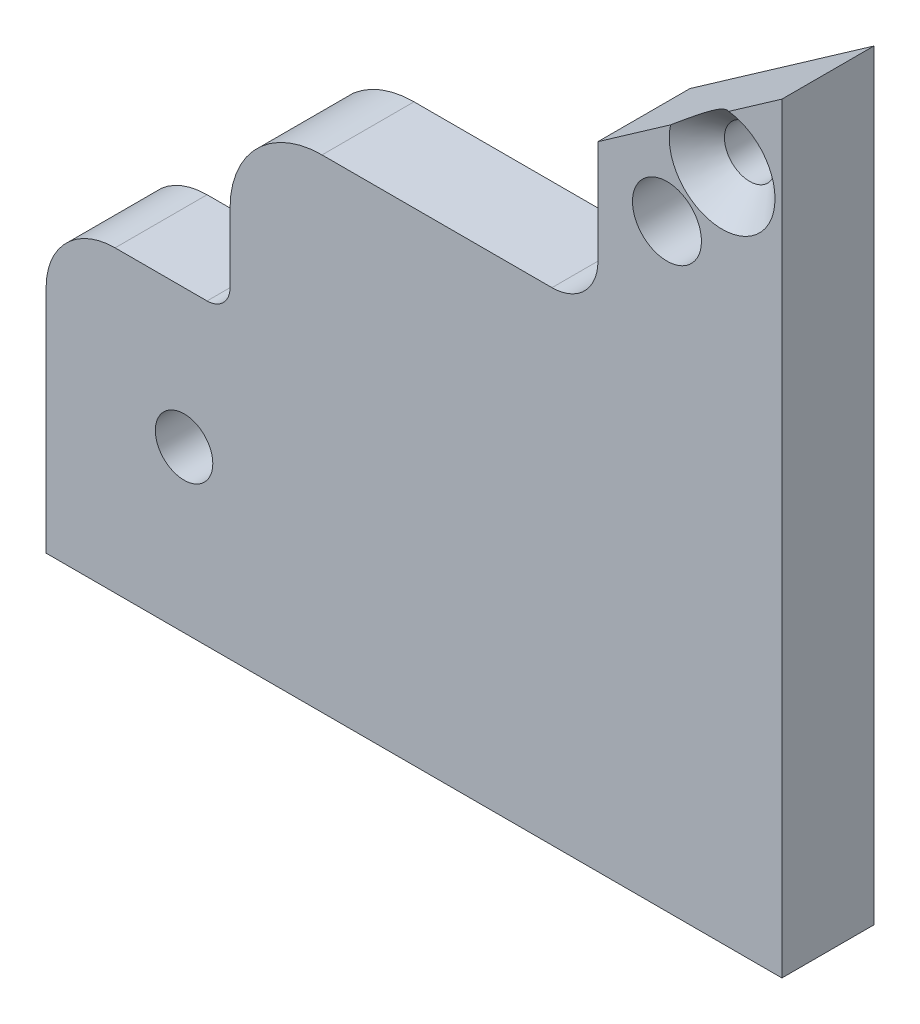
ISO-10303-21;
HEADER;
FILE_DESCRIPTION(('STEP AP214'),'2;1');
FILE_NAME('part.step','',(''),(''),'','','');
FILE_SCHEMA(('AUTOMOTIVE_DESIGN { 1 0 10303 214 1 1 1 1 }'));
ENDSEC;
DATA;
#1=APPLICATION_CONTEXT('core data for automotive mechanical design processes');
#2=APPLICATION_PROTOCOL_DEFINITION('international standard','automotive_design',2000,#1);
#3=PRODUCT_CONTEXT('',#1,'mechanical');
#4=PRODUCT('Part','Part','',(#3));
#5=PRODUCT_RELATED_PRODUCT_CATEGORY('part','',(#4));
#6=PRODUCT_DEFINITION_FORMATION('','',#4);
#7=PRODUCT_DEFINITION_CONTEXT('part definition',#1,'design');
#8=PRODUCT_DEFINITION('design','',#6,#7);
#9=PRODUCT_DEFINITION_SHAPE('','',#8);
#10=(LENGTH_UNIT() NAMED_UNIT(*) SI_UNIT(.MILLI.,.METRE.));
#11=(NAMED_UNIT(*) PLANE_ANGLE_UNIT() SI_UNIT($,.RADIAN.));
#12=(NAMED_UNIT(*) SI_UNIT($,.STERADIAN.) SOLID_ANGLE_UNIT());
#13=UNCERTAINTY_MEASURE_WITH_UNIT(LENGTH_MEASURE(1.E-05),#10,'distance_accuracy_value','');
#14=(GEOMETRIC_REPRESENTATION_CONTEXT(3) GLOBAL_UNCERTAINTY_ASSIGNED_CONTEXT((#13)) GLOBAL_UNIT_ASSIGNED_CONTEXT((#10,
#11,#12)) REPRESENTATION_CONTEXT('',''));
#15=CARTESIAN_POINT('',(0.,0.,0.));
#16=DIRECTION('',(0.,0.,1.));
#17=DIRECTION('',(1.,0.,0.));
#18=AXIS2_PLACEMENT_3D('',#15,#16,#17);
#19=CARTESIAN_POINT('',(0.,0.,4.));
#20=DIRECTION('',(0.,0.,-1.));
#21=DIRECTION('',(-1.,0.,0.));
#22=AXIS2_PLACEMENT_3D('',#19,#20,#21);
#23=PLANE('',#22);
#24=CARTESIAN_POINT('',(6.,5.000000306,4.));
#25=DIRECTION('',(0.,0.,1.));
#26=DIRECTION('',(1.,0.,0.));
#27=AXIS2_PLACEMENT_3D('',#24,#25,#26);
#28=CIRCLE('',#27,1.25);
#29=CARTESIAN_POINT('',(7.25,5.000000306,4.));
#30=VERTEX_POINT('',#29);
#31=EDGE_CURVE('E539',#30,#30,#28,.T.);
#32=ORIENTED_EDGE('',*,*,#31,.F.);
#33=EDGE_LOOP('',(#32));
#34=FACE_BOUND('',#33,.T.);
#35=CARTESIAN_POINT('',(27.,24.,4.));
#36=DIRECTION('',(0.,0.,1.));
#37=DIRECTION('',(1.,0.,0.));
#38=AXIS2_PLACEMENT_3D('',#35,#36,#37);
#39=CIRCLE('',#38,1.5);
#40=CARTESIAN_POINT('',(28.5,24.,4.));
#41=VERTEX_POINT('',#40);
#42=EDGE_CURVE('E169',#41,#41,#39,.T.);
#43=ORIENTED_EDGE('',*,*,#42,.F.);
#44=EDGE_LOOP('',(#43));
#45=FACE_BOUND('',#44,.T.);
#46=DIRECTION('',(1.,0.,0.));
#47=VECTOR('',#46,1.);
#48=CARTESIAN_POINT('',(8.,19.000000306,4.));
#49=LINE('',#48,#47);
#50=CARTESIAN_POINT('',(12.,19.000000306,4.));
#51=VERTEX_POINT('',#50);
#52=CARTESIAN_POINT('',(22.,19.000000306,4.));
#53=VERTEX_POINT('',#52);
#54=EDGE_CURVE('E175',#51,#53,#49,.T.);
#55=ORIENTED_EDGE('',*,*,#54,.F.);
#56=CARTESIAN_POINT('',(12.,15.000000306,4.));
#57=DIRECTION('',(0.,0.,-1.));
#58=DIRECTION('',(-1.,0.,0.));
#59=AXIS2_PLACEMENT_3D('',#56,#57,#58);
#60=CIRCLE('',#59,4.);
#61=CARTESIAN_POINT('',(8.,15.000000306,4.));
#62=VERTEX_POINT('',#61);
#63=EDGE_CURVE('E54',#51,#62,#60,.F.);
#64=ORIENTED_EDGE('',*,*,#63,.T.);
#65=DIRECTION('',(0.,1.,0.));
#66=VECTOR('',#65,1.);
#67=CARTESIAN_POINT('',(8.,11.000000306,4.));
#68=LINE('',#67,#66);
#69=CARTESIAN_POINT('',(8.,12.000000306,4.));
#70=VERTEX_POINT('',#69);
#71=EDGE_CURVE('E187',#70,#62,#68,.T.);
#72=ORIENTED_EDGE('',*,*,#71,.F.);
#73=CARTESIAN_POINT('',(7.,12.000000306,4.));
#74=DIRECTION('',(0.,0.,-1.));
#75=DIRECTION('',(-1.,0.,0.));
#76=AXIS2_PLACEMENT_3D('',#73,#74,#75);
#77=CIRCLE('',#76,1.);
#78=CARTESIAN_POINT('',(7.,11.000000306,4.));
#79=VERTEX_POINT('',#78);
#80=EDGE_CURVE('E351',#70,#79,#77,.T.);
#81=ORIENTED_EDGE('',*,*,#80,.T.);
#82=DIRECTION('',(1.,0.,0.));
#83=VECTOR('',#82,1.);
#84=CARTESIAN_POINT('',(0.,11.000000306,4.));
#85=LINE('',#84,#83);
#86=CARTESIAN_POINT('',(3.,11.000000306,4.));
#87=VERTEX_POINT('',#86);
#88=EDGE_CURVE('E190',#87,#79,#85,.T.);
#89=ORIENTED_EDGE('',*,*,#88,.F.);
#90=CARTESIAN_POINT('',(3.,8.00000030600001,4.));
#91=DIRECTION('',(0.,0.,-1.));
#92=DIRECTION('',(-1.,0.,0.));
#93=AXIS2_PLACEMENT_3D('',#90,#91,#92);
#94=CIRCLE('',#93,3.);
#95=CARTESIAN_POINT('',(0.,8.00000030600001,4.));
#96=VERTEX_POINT('',#95);
#97=EDGE_CURVE('E306',#87,#96,#94,.F.);
#98=ORIENTED_EDGE('',*,*,#97,.T.);
#99=DIRECTION('',(0.,1.,0.));
#100=VECTOR('',#99,1.);
#101=CARTESIAN_POINT('',(0.,-1.999999694,4.));
#102=LINE('',#101,#100);
#103=CARTESIAN_POINT('',(0.,-1.999999694,4.));
#104=VERTEX_POINT('',#103);
#105=EDGE_CURVE('E196',#104,#96,#102,.T.);
#106=ORIENTED_EDGE('',*,*,#105,.F.);
#107=DIRECTION('',(-1.,0.,0.));
#108=VECTOR('',#107,1.);
#109=CARTESIAN_POINT('',(32.,-1.999999694,4.));
#110=LINE('',#109,#108);
#111=CARTESIAN_POINT('',(32.,-1.999999694,4.));
#112=VERTEX_POINT('',#111);
#113=EDGE_CURVE('E193',#112,#104,#110,.T.);
#114=ORIENTED_EDGE('',*,*,#113,.F.);
#115=DIRECTION('',(0.,-1.,0.));
#116=VECTOR('',#115,1.);
#117=CARTESIAN_POINT('',(32.,31.101660306,4.));
#118=LINE('',#117,#116);
#119=CARTESIAN_POINT('',(32.,31.101660306,4.));
#120=VERTEX_POINT('',#119);
#121=EDGE_CURVE('E201',#120,#112,#118,.T.);
#122=ORIENTED_EDGE('',*,*,#121,.F.);
#123=DIRECTION('',(0.819152044273487,0.573576436373189,0.));
#124=VECTOR('',#123,1.);
#125=CARTESIAN_POINT('',(-4.0853226345545,5.83444537710179,4.));
#126=LINE('',#125,#124);
#127=CARTESIAN_POINT('',(29.686931200116,29.4820320958304,4.));
#128=VERTEX_POINT('',#127);
#129=EDGE_CURVE('E200',#128,#120,#126,.T.);
#130=ORIENTED_EDGE('',*,*,#129,.F.);
#131=CARTESIAN_POINT('',(29.4,27.2,4.));
#132=DIRECTION('',(0.,0.,1.));
#133=DIRECTION('',(1.,0.,0.));
#134=AXIS2_PLACEMENT_3D('',#131,#132,#133);
#135=CIRCLE('',#134,2.3);
#136=CARTESIAN_POINT('',(27.1574550289357,27.7108738129462,4.));
#137=VERTEX_POINT('',#136);
#138=EDGE_CURVE('E163',#137,#128,#135,.T.);
#139=ORIENTED_EDGE('',*,*,#138,.F.);
#140=CARTESIAN_POINT('',(24.,25.5,4.));
#141=VERTEX_POINT('',#140);
#142=EDGE_CURVE('E205',#141,#137,#126,.T.);
#143=ORIENTED_EDGE('',*,*,#142,.F.);
#144=DIRECTION('',(0.,1.,0.));
#145=VECTOR('',#144,1.);
#146=CARTESIAN_POINT('',(24.,19.000000306,4.));
#147=LINE('',#146,#145);
#148=CARTESIAN_POINT('',(24.,21.000000306,4.));
#149=VERTEX_POINT('',#148);
#150=EDGE_CURVE('E179',#149,#141,#147,.T.);
#151=ORIENTED_EDGE('',*,*,#150,.F.);
#152=CARTESIAN_POINT('',(22.,21.000000306,4.));
#153=DIRECTION('',(0.,0.,-1.));
#154=DIRECTION('',(-1.,0.,0.));
#155=AXIS2_PLACEMENT_3D('',#152,#153,#154);
#156=CIRCLE('',#155,2.);
#157=EDGE_CURVE('E331',#149,#53,#156,.T.);
#158=ORIENTED_EDGE('',*,*,#157,.T.);
#159=EDGE_LOOP('',(#55,#64,#72,#81,#89,#98,#106,#114,#122,#130,#139,#143,#151,#158));
#160=FACE_BOUND('',#159,.T.);
#161=ADVANCED_FACE('F32',(#34,#45,#160),#23,.F.);
#162=CARTESIAN_POINT('',(32.,-1.999999694,4.));
#163=DIRECTION('',(0.,-1.,0.));
#164=DIRECTION('',(0.,0.,-1.));
#165=AXIS2_PLACEMENT_3D('',#162,#163,#164);
#166=PLANE('',#165);
#167=CARTESIAN_POINT('',(10.,-1.999999694,2.));
#168=DIRECTION('',(0.,-1.,0.));
#169=DIRECTION('',(0.,0.,-1.));
#170=AXIS2_PLACEMENT_3D('',#167,#168,#169);
#171=CIRCLE('',#170,1.24999999999999);
#172=CARTESIAN_POINT('',(10.,-1.999999694,0.750000000000011));
#173=VERTEX_POINT('',#172);
#174=EDGE_CURVE('E145',#173,#173,#171,.T.);
#175=ORIENTED_EDGE('',*,*,#174,.F.);
#176=EDGE_LOOP('',(#175));
#177=FACE_BOUND('',#176,.T.);
#178=CARTESIAN_POINT('',(19.5,-1.999999694,2.));
#179=DIRECTION('',(0.,-1.,0.));
#180=DIRECTION('',(0.,0.,-1.));
#181=AXIS2_PLACEMENT_3D('',#178,#179,#180);
#182=CIRCLE('',#181,1.24999999999999);
#183=CARTESIAN_POINT('',(19.5,-1.999999694,0.750000000000013));
#184=VERTEX_POINT('',#183);
#185=EDGE_CURVE('E144',#184,#184,#182,.T.);
#186=ORIENTED_EDGE('',*,*,#185,.F.);
#187=EDGE_LOOP('',(#186));
#188=FACE_BOUND('',#187,.T.);
#189=CARTESIAN_POINT('',(29.,-1.999999694,2.));
#190=DIRECTION('',(0.,-1.,0.));
#191=DIRECTION('',(0.,0.,-1.));
#192=AXIS2_PLACEMENT_3D('',#189,#190,#191);
#193=CIRCLE('',#192,1.24999999999999);
#194=CARTESIAN_POINT('',(29.,-1.999999694,0.750000000000013));
#195=VERTEX_POINT('',#194);
#196=EDGE_CURVE('E157',#195,#195,#193,.T.);
#197=ORIENTED_EDGE('',*,*,#196,.F.);
#198=EDGE_LOOP('',(#197));
#199=FACE_BOUND('',#198,.T.);
#200=DIRECTION('',(-1.,0.,0.));
#201=VECTOR('',#200,1.);
#202=CARTESIAN_POINT('',(32.,-1.999999694,0.));
#203=LINE('',#202,#201);
#204=CARTESIAN_POINT('',(32.,-1.999999694,0.));
#205=VERTEX_POINT('',#204);
#206=CARTESIAN_POINT('',(0.,-1.999999694,0.));
#207=VERTEX_POINT('',#206);
#208=EDGE_CURVE('E189',#205,#207,#203,.T.);
#209=ORIENTED_EDGE('',*,*,#208,.F.);
#210=DIRECTION('',(0.,0.,-1.));
#211=VECTOR('',#210,1.);
#212=CARTESIAN_POINT('',(32.,-1.999999694,4.));
#213=LINE('',#212,#211);
#214=EDGE_CURVE('E214',#112,#205,#213,.T.);
#215=ORIENTED_EDGE('',*,*,#214,.F.);
#216=ORIENTED_EDGE('',*,*,#113,.T.);
#217=DIRECTION('',(0.,0.,-1.));
#218=VECTOR('',#217,1.);
#219=CARTESIAN_POINT('',(0.,-1.999999694,4.));
#220=LINE('',#219,#218);
#221=EDGE_CURVE('E204',#104,#207,#220,.T.);
#222=ORIENTED_EDGE('',*,*,#221,.T.);
#223=EDGE_LOOP('',(#209,#215,#216,#222));
#224=FACE_BOUND('',#223,.T.);
#225=ADVANCED_FACE('F272',(#177,#188,#199,#224),#166,.T.);
#226=CARTESIAN_POINT('',(32.,31.101660306,4.));
#227=DIRECTION('',(1.,0.,0.));
#228=DIRECTION('',(0.,1.,0.));
#229=AXIS2_PLACEMENT_3D('',#226,#227,#228);
#230=PLANE('',#229);
#231=DIRECTION('',(0.,-1.,0.));
#232=VECTOR('',#231,1.);
#233=CARTESIAN_POINT('',(32.,31.101660306,0.));
#234=LINE('',#233,#232);
#235=CARTESIAN_POINT('',(32.,31.101660306,0.));
#236=VERTEX_POINT('',#235);
#237=EDGE_CURVE('E197',#236,#205,#234,.T.);
#238=ORIENTED_EDGE('',*,*,#237,.F.);
#239=DIRECTION('',(0.,0.,-1.));
#240=VECTOR('',#239,1.);
#241=CARTESIAN_POINT('',(32.,31.101660306,4.));
#242=LINE('',#241,#240);
#243=EDGE_CURVE('E217',#120,#236,#242,.T.);
#244=ORIENTED_EDGE('',*,*,#243,.F.);
#245=ORIENTED_EDGE('',*,*,#121,.T.);
#246=ORIENTED_EDGE('',*,*,#214,.T.);
#247=EDGE_LOOP('',(#238,#244,#245,#246));
#248=FACE_BOUND('',#247,.T.);
#249=ADVANCED_FACE('F278',(#248),#230,.T.);
#250=CARTESIAN_POINT('',(32.,31.101660306,4.));
#251=DIRECTION('',(-0.573576436373189,0.819152044273487,0.));
#252=DIRECTION('',(-0.819152044273487,-0.573576436373189,0.));
#253=AXIS2_PLACEMENT_3D('',#250,#251,#252);
#254=PLANE('',#253);
#255=CARTESIAN_POINT('',(29.6871752413753,29.4822029753598,4.0002));
#256=CARTESIAN_POINT('',(29.6563174845452,29.4605961414138,3.97491308650536));
#257=CARTESIAN_POINT('',(29.6252700095637,29.4388564653882,3.94997173756694));
#258=CARTESIAN_POINT('',(29.5627369877199,29.3950703721036,3.90089970834249));
#259=CARTESIAN_POINT('',(29.5312513271724,29.3730238752415,3.87676924419805));
#260=CARTESIAN_POINT('',(29.4357242058154,29.30613506476,3.80553281197614));
#261=CARTESIAN_POINT('',(29.3709514727864,29.26078070882,3.75986326771957));
#262=CARTESIAN_POINT('',(29.2370140747331,29.1669967330495,3.67248883989887));
#263=CARTESIAN_POINT('',(29.1677755101563,29.1185153681952,3.63095068172284));
#264=CARTESIAN_POINT('',(29.0265235255745,29.0196096637982,3.55592828304742));
#265=CARTESIAN_POINT('',(28.9545170335315,28.9691901752668,3.52242528268573));
#266=CARTESIAN_POINT('',(28.839332131466,28.888536838548,3.47852790803711));
#267=CARTESIAN_POINT('',(28.7971092689902,28.8589720719559,3.46439804019855));
#268=CARTESIAN_POINT('',(28.7118568240857,28.7992776673795,3.44030735575251));
#269=CARTESIAN_POINT('',(28.6688272109409,28.7691480078876,3.43034669822101));
#270=CARTESIAN_POINT('',(28.5827482560978,28.7088748748218,3.41520738247593));
#271=CARTESIAN_POINT('',(28.5397058807132,28.6787362791133,3.40997052081304));
#272=CARTESIAN_POINT('',(28.453408580565,28.6183102590189,3.40436894590551));
#273=CARTESIAN_POINT('',(28.4101536724635,28.5880228462999,3.40400385663571));
#274=CARTESIAN_POINT('',(28.323770098958,28.5275364169503,3.40817039058304));
#275=CARTESIAN_POINT('',(28.2806415582932,28.4973374876631,3.41270583228457));
#276=CARTESIAN_POINT('',(28.1948895301399,28.43729327113,3.42640870532257));
#277=CARTESIAN_POINT('',(28.1522661034704,28.40744802647,3.43557668876262));
#278=CARTESIAN_POINT('',(28.0245129596602,28.3179943121389,3.46961039771885));
#279=CARTESIAN_POINT('',(27.9405224590675,28.2591835304825,3.50093922253187));
#280=CARTESIAN_POINT('',(27.7952433970048,28.1574580360763,3.56729608258622));
#281=CARTESIAN_POINT('',(27.7331464262419,28.1139772690457,3.59985040505804));
#282=CARTESIAN_POINT('',(27.6109886602601,28.0284414804494,3.67042418593524));
#283=CARTESIAN_POINT('',(27.5509304609802,27.9863882765799,3.70845031104726));
#284=CARTESIAN_POINT('',(27.4343948231385,27.9047891444884,3.78732204805841));
#285=CARTESIAN_POINT('',(27.3778640257031,27.8652058539808,3.82805223830328));
#286=CARTESIAN_POINT('',(27.2664346427706,27.787182160069,3.91226213513065));
#287=CARTESIAN_POINT('',(27.2115314597235,27.7487385374254,3.95573273649033));
#288=CARTESIAN_POINT('',(27.1572109876764,27.7107029334168,4.0002));
#289=B_SPLINE_CURVE_WITH_KNOTS('',3,(#255,#256,#257,#258,#259,#260,#261,#262,#263,#264,#265,
#266,#267,#268,#269,#270,#271,#272,#273,#274,#275,#276,#277,#278,#279,#280,#281,#282,#283,#284,
#285,#286,#287,#288),.UNSPECIFIED.,.F.,.F.,(4,2,2,2,2,2,2,2,2,2,2,2,2,2,2,2,4),(0.,
0.136107448133705,0.272250892530432,0.546037490513639,0.828308752564645,1.1099144303528,
1.27011034893967,1.43031237923538,1.58851242096433,1.74670025203663,1.90501143171284,
2.06334148327353,2.38370159800648,2.63098941649179,2.87858111616212,3.11891025636134,
3.35847915440165),.UNSPECIFIED.);
#290=EDGE_CURVE('E216',#128,#137,#289,.T.);
#291=ORIENTED_EDGE('',*,*,#290,.F.);
#292=ORIENTED_EDGE('',*,*,#129,.T.);
#293=ORIENTED_EDGE('',*,*,#243,.T.);
#294=DIRECTION('',(0.819152044273487,0.573576436373189,0.));
#295=VECTOR('',#294,1.);
#296=CARTESIAN_POINT('',(-4.0853226345545,5.83444537710179,0.));
#297=LINE('',#296,#295);
#298=CARTESIAN_POINT('',(24.,25.5,0.));
#299=VERTEX_POINT('',#298);
#300=EDGE_CURVE('E211',#299,#236,#297,.T.);
#301=ORIENTED_EDGE('',*,*,#300,.F.);
#302=DIRECTION('',(0.,0.,1.));
#303=VECTOR('',#302,1.);
#304=CARTESIAN_POINT('',(24.,25.5,0.));
#305=LINE('',#304,#303);
#306=EDGE_CURVE('E181',#299,#141,#305,.T.);
#307=ORIENTED_EDGE('',*,*,#306,.T.);
#308=ORIENTED_EDGE('',*,*,#142,.T.);
#309=EDGE_LOOP('',(#291,#292,#293,#301,#307,#308));
#310=FACE_BOUND('',#309,.T.);
#311=ADVANCED_FACE('F234',(#310),#254,.T.);
#312=CARTESIAN_POINT('',(0.,-1.999999694,4.));
#313=DIRECTION('',(-1.,0.,0.));
#314=DIRECTION('',(0.,0.,1.));
#315=AXIS2_PLACEMENT_3D('',#312,#313,#314);
#316=PLANE('',#315);
#317=ORIENTED_EDGE('',*,*,#105,.T.);
#318=DIRECTION('',(0.,0.,1.));
#319=VECTOR('',#318,1.);
#320=CARTESIAN_POINT('',(0.,8.00000030600001,0.));
#321=LINE('',#320,#319);
#322=CARTESIAN_POINT('',(0.,8.00000030600001,0.));
#323=VERTEX_POINT('',#322);
#324=EDGE_CURVE('E308',#96,#323,#321,.F.);
#325=ORIENTED_EDGE('',*,*,#324,.T.);
#326=DIRECTION('',(0.,1.,0.));
#327=VECTOR('',#326,1.);
#328=CARTESIAN_POINT('',(0.,-1.999999694,0.));
#329=LINE('',#328,#327);
#330=EDGE_CURVE('E208',#207,#323,#329,.T.);
#331=ORIENTED_EDGE('',*,*,#330,.F.);
#332=ORIENTED_EDGE('',*,*,#221,.F.);
#333=EDGE_LOOP('',(#317,#325,#331,#332));
#334=FACE_BOUND('',#333,.T.);
#335=ADVANCED_FACE('F276',(#334),#316,.T.);
#336=CARTESIAN_POINT('',(0.,0.,0.));
#337=DIRECTION('',(0.,0.,-1.));
#338=DIRECTION('',(-1.,0.,0.));
#339=AXIS2_PLACEMENT_3D('',#336,#337,#338);
#340=PLANE('',#339);
#341=CARTESIAN_POINT('',(6.,5.000000306,0.));
#342=DIRECTION('',(0.,0.,1.));
#343=DIRECTION('',(1.,0.,0.));
#344=AXIS2_PLACEMENT_3D('',#341,#342,#343);
#345=CIRCLE('',#344,1.25);
#346=CARTESIAN_POINT('',(7.25,5.000000306,0.));
#347=VERTEX_POINT('',#346);
#348=EDGE_CURVE('E151',#347,#347,#345,.T.);
#349=ORIENTED_EDGE('',*,*,#348,.T.);
#350=EDGE_LOOP('',(#349));
#351=FACE_BOUND('',#350,.T.);
#352=CARTESIAN_POINT('',(29.4,27.2,0.));
#353=DIRECTION('',(0.,0.,-1.));
#354=DIRECTION('',(-1.,0.,0.));
#355=AXIS2_PLACEMENT_3D('',#352,#353,#354);
#356=CIRCLE('',#355,1.09999999999999);
#357=CARTESIAN_POINT('',(28.3,27.2,0.));
#358=VERTEX_POINT('',#357);
#359=EDGE_CURVE('E168',#358,#358,#356,.T.);
#360=ORIENTED_EDGE('',*,*,#359,.F.);
#361=EDGE_LOOP('',(#360));
#362=FACE_BOUND('',#361,.T.);
#363=CARTESIAN_POINT('',(27.,24.,0.));
#364=DIRECTION('',(0.,0.,1.));
#365=DIRECTION('',(1.,0.,0.));
#366=AXIS2_PLACEMENT_3D('',#363,#364,#365);
#367=CIRCLE('',#366,1.5);
#368=CARTESIAN_POINT('',(28.5,24.,0.));
#369=VERTEX_POINT('',#368);
#370=EDGE_CURVE('E172',#369,#369,#367,.T.);
#371=ORIENTED_EDGE('',*,*,#370,.T.);
#372=EDGE_LOOP('',(#371));
#373=FACE_BOUND('',#372,.T.);
#374=DIRECTION('',(0.,1.,0.));
#375=VECTOR('',#374,1.);
#376=CARTESIAN_POINT('',(8.,11.000000306,0.));
#377=LINE('',#376,#375);
#378=CARTESIAN_POINT('',(8.,12.000000306,0.));
#379=VERTEX_POINT('',#378);
#380=CARTESIAN_POINT('',(8.,15.000000306,0.));
#381=VERTEX_POINT('',#380);
#382=EDGE_CURVE('E186',#379,#381,#377,.T.);
#383=ORIENTED_EDGE('',*,*,#382,.T.);
#384=CARTESIAN_POINT('',(12.,15.000000306,0.));
#385=DIRECTION('',(0.,0.,-1.));
#386=DIRECTION('',(-1.,0.,0.));
#387=AXIS2_PLACEMENT_3D('',#384,#385,#386);
#388=CIRCLE('',#387,4.);
#389=CARTESIAN_POINT('',(12.,19.000000306,0.));
#390=VERTEX_POINT('',#389);
#391=EDGE_CURVE('E11',#381,#390,#388,.T.);
#392=ORIENTED_EDGE('',*,*,#391,.T.);
#393=DIRECTION('',(1.,0.,0.));
#394=VECTOR('',#393,1.);
#395=CARTESIAN_POINT('',(8.,19.000000306,0.));
#396=LINE('',#395,#394);
#397=CARTESIAN_POINT('',(22.,19.000000306,0.));
#398=VERTEX_POINT('',#397);
#399=EDGE_CURVE('E176',#390,#398,#396,.T.);
#400=ORIENTED_EDGE('',*,*,#399,.T.);
#401=CARTESIAN_POINT('',(22.,21.000000306,0.));
#402=DIRECTION('',(0.,0.,-1.));
#403=DIRECTION('',(-1.,0.,0.));
#404=AXIS2_PLACEMENT_3D('',#401,#402,#403);
#405=CIRCLE('',#404,2.);
#406=CARTESIAN_POINT('',(24.,21.000000306,0.));
#407=VERTEX_POINT('',#406);
#408=EDGE_CURVE('E337',#398,#407,#405,.F.);
#409=ORIENTED_EDGE('',*,*,#408,.T.);
#410=DIRECTION('',(0.,1.,0.));
#411=VECTOR('',#410,1.);
#412=CARTESIAN_POINT('',(24.,19.000000306,0.));
#413=LINE('',#412,#411);
#414=EDGE_CURVE('E178',#407,#299,#413,.T.);
#415=ORIENTED_EDGE('',*,*,#414,.T.);
#416=ORIENTED_EDGE('',*,*,#300,.T.);
#417=ORIENTED_EDGE('',*,*,#237,.T.);
#418=ORIENTED_EDGE('',*,*,#208,.T.);
#419=ORIENTED_EDGE('',*,*,#330,.T.);
#420=CARTESIAN_POINT('',(3.,8.00000030600001,0.));
#421=DIRECTION('',(0.,0.,-1.));
#422=DIRECTION('',(-1.,0.,0.));
#423=AXIS2_PLACEMENT_3D('',#420,#421,#422);
#424=CIRCLE('',#423,3.);
#425=CARTESIAN_POINT('',(3.,11.000000306,0.));
#426=VERTEX_POINT('',#425);
#427=EDGE_CURVE('E314',#323,#426,#424,.T.);
#428=ORIENTED_EDGE('',*,*,#427,.T.);
#429=DIRECTION('',(1.,0.,0.));
#430=VECTOR('',#429,1.);
#431=CARTESIAN_POINT('',(0.,11.000000306,0.));
#432=LINE('',#431,#430);
#433=CARTESIAN_POINT('',(7.,11.000000306,0.));
#434=VERTEX_POINT('',#433);
#435=EDGE_CURVE('E184',#426,#434,#432,.T.);
#436=ORIENTED_EDGE('',*,*,#435,.T.);
#437=CARTESIAN_POINT('',(7.,12.000000306,0.));
#438=DIRECTION('',(0.,0.,-1.));
#439=DIRECTION('',(-1.,0.,0.));
#440=AXIS2_PLACEMENT_3D('',#437,#438,#439);
#441=CIRCLE('',#440,1.);
#442=EDGE_CURVE('E344',#434,#379,#441,.F.);
#443=ORIENTED_EDGE('',*,*,#442,.T.);
#444=EDGE_LOOP('',(#383,#392,#400,#409,#415,#416,#417,#418,#419,#428,#436,#443));
#445=FACE_BOUND('',#444,.T.);
#446=ADVANCED_FACE('F266',(#351,#362,#373,#445),#340,.T.);
#447=CARTESIAN_POINT('',(8.,11.000000306,0.));
#448=DIRECTION('',(1.,0.,0.));
#449=DIRECTION('',(0.,0.,-1.));
#450=AXIS2_PLACEMENT_3D('',#447,#448,#449);
#451=PLANE('',#450);
#452=ORIENTED_EDGE('',*,*,#71,.T.);
#453=DIRECTION('',(0.,0.,1.));
#454=VECTOR('',#453,1.);
#455=CARTESIAN_POINT('',(8.,15.000000306,0.));
#456=LINE('',#455,#454);
#457=EDGE_CURVE('E40',#62,#381,#456,.F.);
#458=ORIENTED_EDGE('',*,*,#457,.T.);
#459=ORIENTED_EDGE('',*,*,#382,.F.);
#460=DIRECTION('',(0.,0.,1.));
#461=VECTOR('',#460,1.);
#462=CARTESIAN_POINT('',(8.,12.000000306,4.));
#463=LINE('',#462,#461);
#464=EDGE_CURVE('E232',#379,#70,#463,.T.);
#465=ORIENTED_EDGE('',*,*,#464,.T.);
#466=EDGE_LOOP('',(#452,#458,#459,#465));
#467=FACE_BOUND('',#466,.T.);
#468=ADVANCED_FACE('F263',(#467),#451,.F.);
#469=CARTESIAN_POINT('',(0.,11.000000306,0.));
#470=DIRECTION('',(0.,-1.,0.));
#471=DIRECTION('',(0.,0.,-1.));
#472=AXIS2_PLACEMENT_3D('',#469,#470,#471);
#473=PLANE('',#472);
#474=ORIENTED_EDGE('',*,*,#435,.F.);
#475=DIRECTION('',(0.,0.,1.));
#476=VECTOR('',#475,1.);
#477=CARTESIAN_POINT('',(3.,11.000000306,4.));
#478=LINE('',#477,#476);
#479=EDGE_CURVE('E318',#426,#87,#478,.T.);
#480=ORIENTED_EDGE('',*,*,#479,.T.);
#481=ORIENTED_EDGE('',*,*,#88,.T.);
#482=DIRECTION('',(0.,0.,1.));
#483=VECTOR('',#482,1.);
#484=CARTESIAN_POINT('',(7.,11.000000306,0.));
#485=LINE('',#484,#483);
#486=EDGE_CURVE('E356',#79,#434,#485,.F.);
#487=ORIENTED_EDGE('',*,*,#486,.T.);
#488=EDGE_LOOP('',(#474,#480,#481,#487));
#489=FACE_BOUND('',#488,.T.);
#490=ADVANCED_FACE('F258',(#489),#473,.F.);
#491=CARTESIAN_POINT('',(24.,19.000000306,0.));
#492=DIRECTION('',(1.,0.,0.));
#493=DIRECTION('',(0.,1.,0.));
#494=AXIS2_PLACEMENT_3D('',#491,#492,#493);
#495=PLANE('',#494);
#496=ORIENTED_EDGE('',*,*,#414,.F.);
#497=DIRECTION('',(0.,0.,1.));
#498=VECTOR('',#497,1.);
#499=CARTESIAN_POINT('',(24.,21.000000306,4.));
#500=LINE('',#499,#498);
#501=EDGE_CURVE('E342',#407,#149,#500,.T.);
#502=ORIENTED_EDGE('',*,*,#501,.T.);
#503=ORIENTED_EDGE('',*,*,#150,.T.);
#504=ORIENTED_EDGE('',*,*,#306,.F.);
#505=EDGE_LOOP('',(#496,#502,#503,#504));
#506=FACE_BOUND('',#505,.T.);
#507=ADVANCED_FACE('F255',(#506),#495,.F.);
#508=CARTESIAN_POINT('',(8.,19.000000306,0.));
#509=DIRECTION('',(0.,-1.,0.));
#510=DIRECTION('',(0.,0.,-1.));
#511=AXIS2_PLACEMENT_3D('',#508,#509,#510);
#512=PLANE('',#511);
#513=ORIENTED_EDGE('',*,*,#399,.F.);
#514=DIRECTION('',(0.,0.,1.));
#515=VECTOR('',#514,1.);
#516=CARTESIAN_POINT('',(12.,19.000000306,0.));
#517=LINE('',#516,#515);
#518=EDGE_CURVE('E316',#390,#51,#517,.T.);
#519=ORIENTED_EDGE('',*,*,#518,.T.);
#520=ORIENTED_EDGE('',*,*,#54,.T.);
#521=DIRECTION('',(0.,0.,1.));
#522=VECTOR('',#521,1.);
#523=CARTESIAN_POINT('',(22.,19.000000306,0.));
#524=LINE('',#523,#522);
#525=EDGE_CURVE('E338',#53,#398,#524,.F.);
#526=ORIENTED_EDGE('',*,*,#525,.T.);
#527=EDGE_LOOP('',(#513,#519,#520,#526));
#528=FACE_BOUND('',#527,.T.);
#529=ADVANCED_FACE('F253',(#528),#512,.F.);
#530=CARTESIAN_POINT('',(27.,24.,4.));
#531=DIRECTION('',(0.,0.,1.));
#532=DIRECTION('',(1.,0.,0.));
#533=AXIS2_PLACEMENT_3D('',#530,#531,#532);
#534=CYLINDRICAL_SURFACE('',#533,1.5);
#535=ORIENTED_EDGE('',*,*,#370,.F.);
#536=EDGE_LOOP('',(#535));
#537=FACE_BOUND('',#536,.T.);
#538=ORIENTED_EDGE('',*,*,#42,.T.);
#539=EDGE_LOOP('',(#538));
#540=FACE_BOUND('',#539,.T.);
#541=ADVANCED_FACE('F249',(#537,#540),#534,.F.);
#542=CARTESIAN_POINT('',(29.4,27.2,4.));
#543=DIRECTION('',(0.,0.,1.));
#544=DIRECTION('',(1.,0.,0.));
#545=AXIS2_PLACEMENT_3D('',#542,#543,#544);
#546=CYLINDRICAL_SURFACE('',#545,1.09999999999999);
#547=ORIENTED_EDGE('',*,*,#359,.T.);
#548=EDGE_LOOP('',(#547));
#549=FACE_BOUND('',#548,.T.);
#550=CARTESIAN_POINT('',(29.4,27.2,2.8));
#551=DIRECTION('',(0.,0.,1.));
#552=DIRECTION('',(1.,0.,0.));
#553=AXIS2_PLACEMENT_3D('',#550,#551,#552);
#554=CIRCLE('',#553,1.1);
#555=CARTESIAN_POINT('',(30.5,27.2,2.8));
#556=VERTEX_POINT('',#555);
#557=EDGE_CURVE('E165',#556,#556,#554,.T.);
#558=ORIENTED_EDGE('',*,*,#557,.T.);
#559=EDGE_LOOP('',(#558));
#560=FACE_BOUND('',#559,.T.);
#561=ADVANCED_FACE('F244',(#549,#560),#546,.F.);
#562=CARTESIAN_POINT('',(29.4,27.2,4.));
#563=DIRECTION('',(0.,0.,1.));
#564=DIRECTION('',(1.,0.,0.));
#565=AXIS2_PLACEMENT_3D('',#562,#563,#564);
#566=CONICAL_SURFACE('',#565,2.3,0.785398163397449);
#567=ORIENTED_EDGE('',*,*,#290,.T.);
#568=ORIENTED_EDGE('',*,*,#138,.T.);
#569=EDGE_LOOP('',(#567,#568));
#570=FACE_BOUND('',#569,.T.);
#571=ORIENTED_EDGE('',*,*,#557,.F.);
#572=EDGE_LOOP('',(#571));
#573=FACE_BOUND('',#572,.T.);
#574=ADVANCED_FACE('F238',(#570,#573),#566,.F.);
#575=CARTESIAN_POINT('',(29.,5.50000030599999,2.));
#576=DIRECTION('',(0.,-1.,0.));
#577=DIRECTION('',(0.,0.,-1.));
#578=AXIS2_PLACEMENT_3D('',#575,#576,#577);
#579=CONICAL_SURFACE('',#578,1.24999999999999,1.02974425867664);
#580=CARTESIAN_POINT('',(29.,6.25107607978445,2.));
#581=VERTEX_POINT('',#580);
#582=VERTEX_LOOP('',#581);
#583=FACE_BOUND('',#582,.T.);
#584=CARTESIAN_POINT('',(29.,5.50000030599999,2.));
#585=DIRECTION('',(0.,-1.,0.));
#586=DIRECTION('',(0.,0.,-1.));
#587=AXIS2_PLACEMENT_3D('',#584,#585,#586);
#588=CIRCLE('',#587,1.24999999999999);
#589=CARTESIAN_POINT('',(29.,5.50000030599999,0.750000000000013));
#590=VERTEX_POINT('',#589);
#591=EDGE_CURVE('E160',#590,#590,#588,.T.);
#592=ORIENTED_EDGE('',*,*,#591,.T.);
#593=EDGE_LOOP('',(#592));
#594=FACE_BOUND('',#593,.T.);
#595=ADVANCED_FACE('F243',(#583,#594),#579,.F.);
#596=CARTESIAN_POINT('',(29.,-1.999999694,2.));
#597=DIRECTION('',(0.,-1.,0.));
#598=DIRECTION('',(0.,0.,-1.));
#599=AXIS2_PLACEMENT_3D('',#596,#597,#598);
#600=CYLINDRICAL_SURFACE('',#599,1.24999999999999);
#601=ORIENTED_EDGE('',*,*,#591,.F.);
#602=EDGE_LOOP('',(#601));
#603=FACE_BOUND('',#602,.T.);
#604=ORIENTED_EDGE('',*,*,#196,.T.);
#605=EDGE_LOOP('',(#604));
#606=FACE_BOUND('',#605,.T.);
#607=ADVANCED_FACE('F421',(#603,#606),#600,.F.);
#608=CARTESIAN_POINT('',(19.5,5.50000030599999,2.));
#609=DIRECTION('',(0.,-1.,0.));
#610=DIRECTION('',(0.,0.,-1.));
#611=AXIS2_PLACEMENT_3D('',#608,#609,#610);
#612=CONICAL_SURFACE('',#611,1.24999999999999,1.02974425867664);
#613=CARTESIAN_POINT('',(19.5,6.25107607978445,2.));
#614=VERTEX_POINT('',#613);
#615=VERTEX_LOOP('',#614);
#616=FACE_BOUND('',#615,.T.);
#617=CARTESIAN_POINT('',(19.5,5.50000030599999,2.));
#618=DIRECTION('',(0.,-1.,0.));
#619=DIRECTION('',(0.,0.,-1.));
#620=AXIS2_PLACEMENT_3D('',#617,#618,#619);
#621=CIRCLE('',#620,1.24999999999999);
#622=CARTESIAN_POINT('',(19.5,5.50000030599999,0.750000000000013));
#623=VERTEX_POINT('',#622);
#624=EDGE_CURVE('E148',#623,#623,#621,.T.);
#625=ORIENTED_EDGE('',*,*,#624,.T.);
#626=EDGE_LOOP('',(#625));
#627=FACE_BOUND('',#626,.T.);
#628=ADVANCED_FACE('F428',(#616,#627),#612,.F.);
#629=CARTESIAN_POINT('',(19.5,-1.999999694,2.));
#630=DIRECTION('',(0.,-1.,0.));
#631=DIRECTION('',(0.,0.,-1.));
#632=AXIS2_PLACEMENT_3D('',#629,#630,#631);
#633=CYLINDRICAL_SURFACE('',#632,1.24999999999999);
#634=ORIENTED_EDGE('',*,*,#624,.F.);
#635=EDGE_LOOP('',(#634));
#636=FACE_BOUND('',#635,.T.);
#637=ORIENTED_EDGE('',*,*,#185,.T.);
#638=EDGE_LOOP('',(#637));
#639=FACE_BOUND('',#638,.T.);
#640=ADVANCED_FACE('F138',(#636,#639),#633,.F.);
#641=CARTESIAN_POINT('',(10.,5.50000030599999,2.));
#642=DIRECTION('',(0.,-1.,0.));
#643=DIRECTION('',(0.,0.,-1.));
#644=AXIS2_PLACEMENT_3D('',#641,#642,#643);
#645=CONICAL_SURFACE('',#644,1.24999999999999,1.02974425867664);
#646=CARTESIAN_POINT('',(10.,6.25107607978445,2.));
#647=VERTEX_POINT('',#646);
#648=VERTEX_LOOP('',#647);
#649=FACE_BOUND('',#648,.T.);
#650=CARTESIAN_POINT('',(10.,5.50000030599999,2.));
#651=DIRECTION('',(0.,-1.,0.));
#652=DIRECTION('',(0.,0.,-1.));
#653=AXIS2_PLACEMENT_3D('',#650,#651,#652);
#654=CIRCLE('',#653,1.24999999999999);
#655=CARTESIAN_POINT('',(10.,5.50000030599999,0.750000000000013));
#656=VERTEX_POINT('',#655);
#657=EDGE_CURVE('E142',#656,#656,#654,.T.);
#658=ORIENTED_EDGE('',*,*,#657,.T.);
#659=EDGE_LOOP('',(#658));
#660=FACE_BOUND('',#659,.T.);
#661=ADVANCED_FACE('F134',(#649,#660),#645,.F.);
#662=CARTESIAN_POINT('',(10.,-1.999999694,2.));
#663=DIRECTION('',(0.,-1.,0.));
#664=DIRECTION('',(0.,0.,-1.));
#665=AXIS2_PLACEMENT_3D('',#662,#663,#664);
#666=CYLINDRICAL_SURFACE('',#665,1.24999999999999);
#667=ORIENTED_EDGE('',*,*,#657,.F.);
#668=EDGE_LOOP('',(#667));
#669=FACE_BOUND('',#668,.T.);
#670=ORIENTED_EDGE('',*,*,#174,.T.);
#671=EDGE_LOOP('',(#670));
#672=FACE_BOUND('',#671,.T.);
#673=ADVANCED_FACE('F137',(#669,#672),#666,.F.);
#674=CARTESIAN_POINT('',(7.,12.000000306,0.));
#675=DIRECTION('',(0.,0.,-1.));
#676=DIRECTION('',(-1.,0.,0.));
#677=AXIS2_PLACEMENT_3D('',#674,#675,#676);
#678=CYLINDRICAL_SURFACE('',#677,1.);
#679=ORIENTED_EDGE('',*,*,#442,.F.);
#680=ORIENTED_EDGE('',*,*,#486,.F.);
#681=ORIENTED_EDGE('',*,*,#80,.F.);
#682=ORIENTED_EDGE('',*,*,#464,.F.);
#683=EDGE_LOOP('',(#679,#680,#681,#682));
#684=FACE_BOUND('',#683,.T.);
#685=ADVANCED_FACE('F359',(#684),#678,.F.);
#686=CARTESIAN_POINT('',(22.,21.000000306,0.));
#687=DIRECTION('',(0.,0.,-1.));
#688=DIRECTION('',(-1.,0.,0.));
#689=AXIS2_PLACEMENT_3D('',#686,#687,#688);
#690=CYLINDRICAL_SURFACE('',#689,2.);
#691=ORIENTED_EDGE('',*,*,#408,.F.);
#692=ORIENTED_EDGE('',*,*,#525,.F.);
#693=ORIENTED_EDGE('',*,*,#157,.F.);
#694=ORIENTED_EDGE('',*,*,#501,.F.);
#695=EDGE_LOOP('',(#691,#692,#693,#694));
#696=FACE_BOUND('',#695,.T.);
#697=ADVANCED_FACE('F341',(#696),#690,.F.);
#698=CARTESIAN_POINT('',(3.,8.00000030600001,0.));
#699=DIRECTION('',(0.,0.,-1.));
#700=DIRECTION('',(-1.,0.,0.));
#701=AXIS2_PLACEMENT_3D('',#698,#699,#700);
#702=CYLINDRICAL_SURFACE('',#701,3.);
#703=ORIENTED_EDGE('',*,*,#427,.F.);
#704=ORIENTED_EDGE('',*,*,#324,.F.);
#705=ORIENTED_EDGE('',*,*,#97,.F.);
#706=ORIENTED_EDGE('',*,*,#479,.F.);
#707=EDGE_LOOP('',(#703,#704,#705,#706));
#708=FACE_BOUND('',#707,.T.);
#709=ADVANCED_FACE('F311',(#708),#702,.T.);
#710=CARTESIAN_POINT('',(12.,15.000000306,0.));
#711=DIRECTION('',(0.,0.,1.));
#712=DIRECTION('',(1.,0.,0.));
#713=AXIS2_PLACEMENT_3D('',#710,#711,#712);
#714=CYLINDRICAL_SURFACE('',#713,4.);
#715=ORIENTED_EDGE('',*,*,#391,.F.);
#716=ORIENTED_EDGE('',*,*,#457,.F.);
#717=ORIENTED_EDGE('',*,*,#63,.F.);
#718=ORIENTED_EDGE('',*,*,#518,.F.);
#719=EDGE_LOOP('',(#715,#716,#717,#718));
#720=FACE_BOUND('',#719,.T.);
#721=ADVANCED_FACE('F34',(#720),#714,.T.);
#722=CARTESIAN_POINT('',(6.,5.000000306,4.));
#723=DIRECTION('',(0.,0.,1.));
#724=DIRECTION('',(1.,0.,0.));
#725=AXIS2_PLACEMENT_3D('',#722,#723,#724);
#726=CYLINDRICAL_SURFACE('',#725,1.25);
#727=ORIENTED_EDGE('',*,*,#348,.F.);
#728=EDGE_LOOP('',(#727));
#729=FACE_BOUND('',#728,.T.);
#730=ORIENTED_EDGE('',*,*,#31,.T.);
#731=EDGE_LOOP('',(#730));
#732=FACE_BOUND('',#731,.T.);
#733=ADVANCED_FACE('F471',(#729,#732),#726,.F.);
#734=CLOSED_SHELL('',(#161,#225,#249,#311,#335,#446,#468,#490,#507,#529,#541,#561,#574,#595,
#607,#628,#640,#661,#673,#685,#697,#709,#721,#733));
#735=MANIFOLD_SOLID_BREP('B2',#734);
#736=ADVANCED_BREP_SHAPE_REPRESENTATION('',(#18,#735),#14);
#737=SHAPE_DEFINITION_REPRESENTATION(#9,#736);
ENDSEC;
END-ISO-10303-21;
